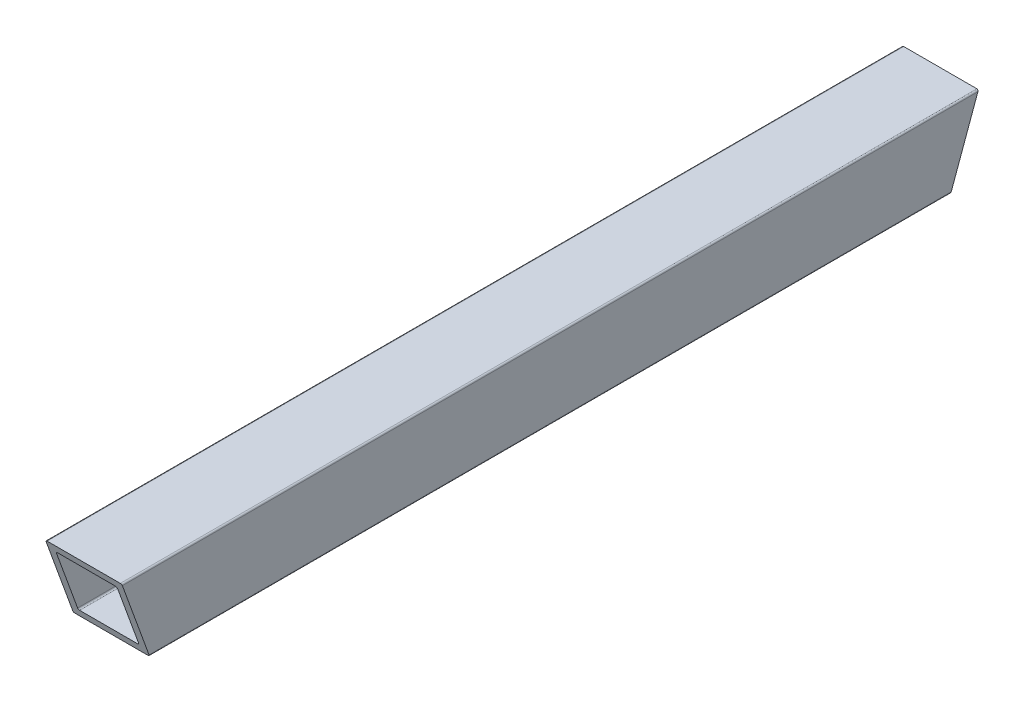
ISO-10303-21;
HEADER;
FILE_DESCRIPTION(('STEP AP214'),'2;1');
FILE_NAME('part.step','',(''),(''),'','','');
FILE_SCHEMA(('AUTOMOTIVE_DESIGN { 1 0 10303 214 1 1 1 1 }'));
ENDSEC;
DATA;
#1=APPLICATION_CONTEXT('core data for automotive mechanical design processes');
#2=APPLICATION_PROTOCOL_DEFINITION('international standard','automotive_design',2000,#1);
#3=PRODUCT_CONTEXT('',#1,'mechanical');
#4=PRODUCT('Part','Part','',(#3));
#5=PRODUCT_RELATED_PRODUCT_CATEGORY('part','',(#4));
#6=PRODUCT_DEFINITION_FORMATION('','',#4);
#7=PRODUCT_DEFINITION_CONTEXT('part definition',#1,'design');
#8=PRODUCT_DEFINITION('design','',#6,#7);
#9=PRODUCT_DEFINITION_SHAPE('','',#8);
#10=(LENGTH_UNIT() NAMED_UNIT(*) SI_UNIT(.MILLI.,.METRE.));
#11=(NAMED_UNIT(*) PLANE_ANGLE_UNIT() SI_UNIT($,.RADIAN.));
#12=(NAMED_UNIT(*) SI_UNIT($,.STERADIAN.) SOLID_ANGLE_UNIT());
#13=UNCERTAINTY_MEASURE_WITH_UNIT(LENGTH_MEASURE(1.E-05),#10,'distance_accuracy_value','');
#14=(GEOMETRIC_REPRESENTATION_CONTEXT(3) GLOBAL_UNCERTAINTY_ASSIGNED_CONTEXT((#13)) GLOBAL_UNIT_ASSIGNED_CONTEXT((#10,
#11,#12)) REPRESENTATION_CONTEXT('',''));
#15=CARTESIAN_POINT('',(0.,0.,0.));
#16=DIRECTION('',(0.,0.,1.));
#17=DIRECTION('',(1.,0.,0.));
#18=AXIS2_PLACEMENT_3D('',#15,#16,#17);
#19=CARTESIAN_POINT('',(-5.,5.,200.));
#20=DIRECTION('',(1.,0.,0.));
#21=DIRECTION('',(0.,1.,0.));
#22=AXIS2_PLACEMENT_3D('',#19,#20,#21);
#23=PLANE('',#22);
#24=DIRECTION('',(0.,0.,-1.));
#25=VECTOR('',#24,1.);
#26=CARTESIAN_POINT('',(-5.,-4.8,200.));
#27=LINE('',#26,#25);
#28=CARTESIAN_POINT('',(-5.,-4.8,3.56690829580883));
#29=VERTEX_POINT('',#28);
#30=CARTESIAN_POINT('',(-5.,-4.8,108.712496389515));
#31=VERTEX_POINT('',#30);
#32=EDGE_CURVE('E275',#29,#31,#27,.F.);
#33=ORIENTED_EDGE('',*,*,#32,.T.);
#34=DIRECTION('',(0.,0.939692620785907,0.342020143325673));
#35=VECTOR('',#34,1.);
#36=CARTESIAN_POINT('',(-5.,-5.,108.639702342662));
#37=LINE('',#36,#35);
#38=CARTESIAN_POINT('',(-5.,4.8,112.206610638471));
#39=VERTEX_POINT('',#38);
#40=EDGE_CURVE('E163',#31,#39,#37,.T.);
#41=ORIENTED_EDGE('',*,*,#40,.T.);
#42=DIRECTION('',(0.,0.,-1.));
#43=VECTOR('',#42,1.);
#44=CARTESIAN_POINT('',(-5.,4.8,200.));
#45=LINE('',#44,#43);
#46=CARTESIAN_POINT('',(-5.,4.8,0.0727940468532356));
#47=VERTEX_POINT('',#46);
#48=EDGE_CURVE('E273',#39,#47,#45,.T.);
#49=ORIENTED_EDGE('',*,*,#48,.T.);
#50=DIRECTION('',(0.,-0.939692620785907,0.342020143325673));
#51=VECTOR('',#50,1.);
#52=CARTESIAN_POINT('',(-5.,-5.,3.63970234266207));
#53=LINE('',#52,#51);
#54=EDGE_CURVE('E187',#47,#29,#53,.T.);
#55=ORIENTED_EDGE('',*,*,#54,.T.);
#56=EDGE_LOOP('',(#33,#41,#49,#55));
#57=FACE_BOUND('',#56,.T.);
#58=ADVANCED_FACE('F34',(#57),#23,.F.);
#59=CARTESIAN_POINT('',(-5.,-5.,200.));
#60=DIRECTION('',(0.,1.,0.));
#61=DIRECTION('',(-1.,0.,0.));
#62=AXIS2_PLACEMENT_3D('',#59,#60,#61);
#63=PLANE('',#62);
#64=DIRECTION('',(0.,0.,-1.));
#65=VECTOR('',#64,1.);
#66=CARTESIAN_POINT('',(4.8,-5.,200.));
#67=LINE('',#66,#65);
#68=CARTESIAN_POINT('',(4.8,-5.,3.63970234266207));
#69=VERTEX_POINT('',#68);
#70=CARTESIAN_POINT('',(4.8,-5.,108.639702342662));
#71=VERTEX_POINT('',#70);
#72=EDGE_CURVE('E269',#69,#71,#67,.F.);
#73=ORIENTED_EDGE('',*,*,#72,.T.);
#74=DIRECTION('',(1.,0.,0.));
#75=VECTOR('',#74,1.);
#76=CARTESIAN_POINT('',(-5.,-5.,108.639702342662));
#77=LINE('',#76,#75);
#78=CARTESIAN_POINT('',(-4.8,-5.,108.639702342662));
#79=VERTEX_POINT('',#78);
#80=EDGE_CURVE('E147',#79,#71,#77,.T.);
#81=ORIENTED_EDGE('',*,*,#80,.F.);
#82=DIRECTION('',(0.,0.,-1.));
#83=VECTOR('',#82,1.);
#84=CARTESIAN_POINT('',(-4.8,-5.,200.));
#85=LINE('',#84,#83);
#86=CARTESIAN_POINT('',(-4.8,-5.,3.63970234266207));
#87=VERTEX_POINT('',#86);
#88=EDGE_CURVE('E271',#79,#87,#85,.T.);
#89=ORIENTED_EDGE('',*,*,#88,.T.);
#90=DIRECTION('',(1.,0.,0.));
#91=VECTOR('',#90,1.);
#92=CARTESIAN_POINT('',(-5.,-5.,3.63970234266207));
#93=LINE('',#92,#91);
#94=EDGE_CURVE('E220',#87,#69,#93,.T.);
#95=ORIENTED_EDGE('',*,*,#94,.T.);
#96=EDGE_LOOP('',(#73,#81,#89,#95));
#97=FACE_BOUND('',#96,.T.);
#98=ADVANCED_FACE('F318',(#97),#63,.F.);
#99=CARTESIAN_POINT('',(5.,5.,200.));
#100=DIRECTION('',(-1.,0.,0.));
#101=DIRECTION('',(0.,-1.,0.));
#102=AXIS2_PLACEMENT_3D('',#99,#100,#101);
#103=PLANE('',#102);
#104=DIRECTION('',(0.,0.,-1.));
#105=VECTOR('',#104,1.);
#106=CARTESIAN_POINT('',(5.,4.8,200.));
#107=LINE('',#106,#105);
#108=CARTESIAN_POINT('',(5.,4.8,0.0727940468532356));
#109=VERTEX_POINT('',#108);
#110=CARTESIAN_POINT('',(5.,4.8,112.206610638471));
#111=VERTEX_POINT('',#110);
#112=EDGE_CURVE('E162',#109,#111,#107,.F.);
#113=ORIENTED_EDGE('',*,*,#112,.T.);
#114=DIRECTION('',(0.,0.939692620785907,0.342020143325673));
#115=VECTOR('',#114,1.);
#116=CARTESIAN_POINT('',(5.,-5.,108.639702342662));
#117=LINE('',#116,#115);
#118=CARTESIAN_POINT('',(5.,-4.8,108.712496389515));
#119=VERTEX_POINT('',#118);
#120=EDGE_CURVE('E56',#119,#111,#117,.T.);
#121=ORIENTED_EDGE('',*,*,#120,.F.);
#122=DIRECTION('',(0.,0.,-1.));
#123=VECTOR('',#122,1.);
#124=CARTESIAN_POINT('',(5.,-4.8,200.));
#125=LINE('',#124,#123);
#126=CARTESIAN_POINT('',(5.,-4.8,3.56690829580883));
#127=VERTEX_POINT('',#126);
#128=EDGE_CURVE('E159',#119,#127,#125,.T.);
#129=ORIENTED_EDGE('',*,*,#128,.T.);
#130=DIRECTION('',(0.,-0.939692620785907,0.342020143325673));
#131=VECTOR('',#130,1.);
#132=CARTESIAN_POINT('',(5.,-5.,3.63970234266207));
#133=LINE('',#132,#131);
#134=EDGE_CURVE('E182',#109,#127,#133,.T.);
#135=ORIENTED_EDGE('',*,*,#134,.F.);
#136=EDGE_LOOP('',(#113,#121,#129,#135));
#137=FACE_BOUND('',#136,.T.);
#138=ADVANCED_FACE('F157',(#137),#103,.F.);
#139=CARTESIAN_POINT('',(-5.,5.,200.));
#140=DIRECTION('',(0.,-1.,0.));
#141=DIRECTION('',(1.,0.,0.));
#142=AXIS2_PLACEMENT_3D('',#139,#140,#141);
#143=PLANE('',#142);
#144=DIRECTION('',(0.,0.,-1.));
#145=VECTOR('',#144,1.);
#146=CARTESIAN_POINT('',(-4.8,5.,200.));
#147=LINE('',#146,#145);
#148=CARTESIAN_POINT('',(-4.8,5.,0.));
#149=VERTEX_POINT('',#148);
#150=CARTESIAN_POINT('',(-4.8,5.,112.279404685324));
#151=VERTEX_POINT('',#150);
#152=EDGE_CURVE('E170',#149,#151,#147,.F.);
#153=ORIENTED_EDGE('',*,*,#152,.T.);
#154=DIRECTION('',(1.,0.,0.));
#155=VECTOR('',#154,1.);
#156=CARTESIAN_POINT('',(-5.,5.,112.279404685324));
#157=LINE('',#156,#155);
#158=CARTESIAN_POINT('',(4.8,5.,112.279404685324));
#159=VERTEX_POINT('',#158);
#160=EDGE_CURVE('E190',#151,#159,#157,.T.);
#161=ORIENTED_EDGE('',*,*,#160,.T.);
#162=DIRECTION('',(0.,0.,-1.));
#163=VECTOR('',#162,1.);
#164=CARTESIAN_POINT('',(4.8,5.,200.));
#165=LINE('',#164,#163);
#166=CARTESIAN_POINT('',(4.8,5.,0.));
#167=VERTEX_POINT('',#166);
#168=EDGE_CURVE('E168',#159,#167,#165,.T.);
#169=ORIENTED_EDGE('',*,*,#168,.T.);
#170=DIRECTION('',(-1.,0.,0.));
#171=VECTOR('',#170,1.);
#172=CARTESIAN_POINT('',(-5.,5.,0.));
#173=LINE('',#172,#171);
#174=EDGE_CURVE('E184',#167,#149,#173,.T.);
#175=ORIENTED_EDGE('',*,*,#174,.T.);
#176=EDGE_LOOP('',(#153,#161,#169,#175));
#177=FACE_BOUND('',#176,.T.);
#178=ADVANCED_FACE('F193',(#177),#143,.F.);
#179=CARTESIAN_POINT('',(-4.,4.,200.));
#180=DIRECTION('',(1.,0.,0.));
#181=DIRECTION('',(0.,1.,0.));
#182=AXIS2_PLACEMENT_3D('',#179,#180,#181);
#183=PLANE('',#182);
#184=DIRECTION('',(0.,0.939692620785907,0.342020143325673));
#185=VECTOR('',#184,1.);
#186=CARTESIAN_POINT('',(-4.,32.3098336697412,122.219371243871));
#187=LINE('',#186,#185);
#188=CARTESIAN_POINT('',(-4.,-3.8,109.076466623782));
#189=VERTEX_POINT('',#188);
#190=CARTESIAN_POINT('',(-4.,3.8,111.842640404205));
#191=VERTEX_POINT('',#190);
#192=EDGE_CURVE('E202',#189,#191,#187,.T.);
#193=ORIENTED_EDGE('',*,*,#192,.F.);
#194=DIRECTION('',(0.,0.,-1.));
#195=VECTOR('',#194,1.);
#196=CARTESIAN_POINT('',(-4.,-3.8,0.));
#197=LINE('',#196,#195);
#198=CARTESIAN_POINT('',(-4.,-3.8,3.20293806154262));
#199=VERTEX_POINT('',#198);
#200=EDGE_CURVE('E264',#189,#199,#197,.T.);
#201=ORIENTED_EDGE('',*,*,#200,.T.);
#202=DIRECTION('',(0.,-0.939692620785907,0.342020143325673));
#203=VECTOR('',#202,1.);
#204=CARTESIAN_POINT('',(-3.99999999999999,-60.1617831902141,23.716949492946));
#205=LINE('',#204,#203);
#206=CARTESIAN_POINT('',(-4.,3.8,0.436764281119419));
#207=VERTEX_POINT('',#206);
#208=EDGE_CURVE('E230',#207,#199,#205,.T.);
#209=ORIENTED_EDGE('',*,*,#208,.F.);
#210=DIRECTION('',(0.,0.,-1.));
#211=VECTOR('',#210,1.);
#212=CARTESIAN_POINT('',(-4.,3.8,200.));
#213=LINE('',#212,#211);
#214=EDGE_CURVE('E266',#207,#191,#213,.F.);
#215=ORIENTED_EDGE('',*,*,#214,.T.);
#216=EDGE_LOOP('',(#193,#201,#209,#215));
#217=FACE_BOUND('',#216,.T.);
#218=ADVANCED_FACE('F307',(#217),#183,.T.);
#219=CARTESIAN_POINT('',(-4.,-4.,200.));
#220=DIRECTION('',(0.,1.,0.));
#221=DIRECTION('',(0.,0.,1.));
#222=AXIS2_PLACEMENT_3D('',#219,#220,#221);
#223=PLANE('',#222);
#224=DIRECTION('',(-1.,0.,0.));
#225=VECTOR('',#224,1.);
#226=CARTESIAN_POINT('',(-4.00000000000001,-4.,109.003672576928));
#227=LINE('',#226,#225);
#228=CARTESIAN_POINT('',(3.8,-4.,109.003672576928));
#229=VERTEX_POINT('',#228);
#230=CARTESIAN_POINT('',(-3.8,-4.,109.003672576928));
#231=VERTEX_POINT('',#230);
#232=EDGE_CURVE('E49',#229,#231,#227,.T.);
#233=ORIENTED_EDGE('',*,*,#232,.F.);
#234=DIRECTION('',(0.,0.,-1.));
#235=VECTOR('',#234,1.);
#236=CARTESIAN_POINT('',(3.8,-4.,0.));
#237=LINE('',#236,#235);
#238=CARTESIAN_POINT('',(3.8,-4.,3.27573210839585));
#239=VERTEX_POINT('',#238);
#240=EDGE_CURVE('E172',#229,#239,#237,.T.);
#241=ORIENTED_EDGE('',*,*,#240,.T.);
#242=DIRECTION('',(1.,0.,0.));
#243=VECTOR('',#242,1.);
#244=CARTESIAN_POINT('',(-3.99999999999999,-4.,3.27573210839585));
#245=LINE('',#244,#243);
#246=CARTESIAN_POINT('',(-3.8,-4.,3.27573210839588));
#247=VERTEX_POINT('',#246);
#248=EDGE_CURVE('E227',#247,#239,#245,.T.);
#249=ORIENTED_EDGE('',*,*,#248,.F.);
#250=DIRECTION('',(0.,0.,-1.));
#251=VECTOR('',#250,1.);
#252=CARTESIAN_POINT('',(-3.8,-4.,200.));
#253=LINE('',#252,#251);
#254=EDGE_CURVE('E278',#247,#231,#253,.F.);
#255=ORIENTED_EDGE('',*,*,#254,.T.);
#256=EDGE_LOOP('',(#233,#241,#249,#255));
#257=FACE_BOUND('',#256,.T.);
#258=ADVANCED_FACE('F283',(#257),#223,.T.);
#259=CARTESIAN_POINT('',(4.,4.,200.));
#260=DIRECTION('',(-1.,0.,0.));
#261=DIRECTION('',(0.,-1.,0.));
#262=AXIS2_PLACEMENT_3D('',#259,#260,#261);
#263=PLANE('',#262);
#264=DIRECTION('',(0.,-0.939692620785907,-0.342020143325673));
#265=VECTOR('',#264,1.);
#266=CARTESIAN_POINT('',(3.99999999999999,32.3098336697412,122.219371243871));
#267=LINE('',#266,#265);
#268=CARTESIAN_POINT('',(4.,3.8,111.842640404205));
#269=VERTEX_POINT('',#268);
#270=CARTESIAN_POINT('',(4.,-3.8,109.076466623782));
#271=VERTEX_POINT('',#270);
#272=EDGE_CURVE('E212',#269,#271,#267,.T.);
#273=ORIENTED_EDGE('',*,*,#272,.F.);
#274=DIRECTION('',(0.,0.,-1.));
#275=VECTOR('',#274,1.);
#276=CARTESIAN_POINT('',(4.,3.8,0.));
#277=LINE('',#276,#275);
#278=CARTESIAN_POINT('',(4.,3.8,0.436764281119419));
#279=VERTEX_POINT('',#278);
#280=EDGE_CURVE('E257',#269,#279,#277,.T.);
#281=ORIENTED_EDGE('',*,*,#280,.T.);
#282=DIRECTION('',(0.,0.939692620785907,-0.342020143325673));
#283=VECTOR('',#282,1.);
#284=CARTESIAN_POINT('',(4.00000000000002,-60.1617831902141,23.716949492946));
#285=LINE('',#284,#283);
#286=CARTESIAN_POINT('',(4.,-3.8,3.20293806154262));
#287=VERTEX_POINT('',#286);
#288=EDGE_CURVE('E242',#287,#279,#285,.T.);
#289=ORIENTED_EDGE('',*,*,#288,.F.);
#290=DIRECTION('',(0.,0.,-1.));
#291=VECTOR('',#290,1.);
#292=CARTESIAN_POINT('',(4.,-3.8,200.));
#293=LINE('',#292,#291);
#294=EDGE_CURVE('E254',#287,#271,#293,.F.);
#295=ORIENTED_EDGE('',*,*,#294,.T.);
#296=EDGE_LOOP('',(#273,#281,#289,#295));
#297=FACE_BOUND('',#296,.T.);
#298=ADVANCED_FACE('F291',(#297),#263,.T.);
#299=CARTESIAN_POINT('',(-4.,4.,200.));
#300=DIRECTION('',(0.,-1.,0.));
#301=DIRECTION('',(0.,0.,-1.));
#302=AXIS2_PLACEMENT_3D('',#299,#300,#301);
#303=PLANE('',#302);
#304=DIRECTION('',(1.,0.,0.));
#305=VECTOR('',#304,1.);
#306=CARTESIAN_POINT('',(-4.00000000000001,4.,111.915434451058));
#307=LINE('',#306,#305);
#308=CARTESIAN_POINT('',(-3.8,4.,111.915434451058));
#309=VERTEX_POINT('',#308);
#310=CARTESIAN_POINT('',(3.8,4.,111.915434451058));
#311=VERTEX_POINT('',#310);
#312=EDGE_CURVE('E210',#309,#311,#307,.T.);
#313=ORIENTED_EDGE('',*,*,#312,.F.);
#314=DIRECTION('',(0.,0.,-1.));
#315=VECTOR('',#314,1.);
#316=CARTESIAN_POINT('',(-3.8,4.,0.));
#317=LINE('',#316,#315);
#318=CARTESIAN_POINT('',(-3.8,4.,0.363970234266198));
#319=VERTEX_POINT('',#318);
#320=EDGE_CURVE('E259',#309,#319,#317,.T.);
#321=ORIENTED_EDGE('',*,*,#320,.T.);
#322=DIRECTION('',(-1.,0.,0.));
#323=VECTOR('',#322,1.);
#324=CARTESIAN_POINT('',(-3.99999999999999,4.,0.363970234266181));
#325=LINE('',#324,#323);
#326=CARTESIAN_POINT('',(3.8,4.,0.363970234266182));
#327=VERTEX_POINT('',#326);
#328=EDGE_CURVE('E239',#327,#319,#325,.T.);
#329=ORIENTED_EDGE('',*,*,#328,.F.);
#330=DIRECTION('',(0.,0.,-1.));
#331=VECTOR('',#330,1.);
#332=CARTESIAN_POINT('',(3.8,4.,200.));
#333=LINE('',#332,#331);
#334=EDGE_CURVE('E261',#327,#311,#333,.F.);
#335=ORIENTED_EDGE('',*,*,#334,.T.);
#336=EDGE_LOOP('',(#313,#321,#329,#335));
#337=FACE_BOUND('',#336,.T.);
#338=ADVANCED_FACE('F299',(#337),#303,.T.);
#339=CARTESIAN_POINT('',(3.8,3.8,200.));
#340=DIRECTION('',(0.,0.,1.));
#341=DIRECTION('',(1.,0.,0.));
#342=AXIS2_PLACEMENT_3D('',#339,#340,#341);
#343=CYLINDRICAL_SURFACE('',#342,0.2);
#344=ORIENTED_EDGE('',*,*,#280,.F.);
#345=CARTESIAN_POINT('',(3.8,3.8,111.842640404205));
#346=DIRECTION('',(0.,0.342020143325673,-0.939692620785907));
#347=DIRECTION('',(0.,0.939692620785907,0.342020143325673));
#348=AXIS2_PLACEMENT_3D('',#345,#346,#347);
#349=ELLIPSE('',#348,0.212835554495183,0.2);
#350=EDGE_CURVE('E214',#269,#311,#349,.F.);
#351=ORIENTED_EDGE('',*,*,#350,.T.);
#352=ORIENTED_EDGE('',*,*,#334,.F.);
#353=CARTESIAN_POINT('',(3.8,3.8,0.436764281119439));
#354=DIRECTION('',(0.,0.342020143325673,0.939692620785907));
#355=DIRECTION('',(0.,-0.939692620785907,0.342020143325673));
#356=AXIS2_PLACEMENT_3D('',#353,#354,#355);
#357=ELLIPSE('',#356,0.212835554495183,0.2);
#358=EDGE_CURVE('E245',#327,#279,#357,.F.);
#359=ORIENTED_EDGE('',*,*,#358,.T.);
#360=EDGE_LOOP('',(#344,#351,#352,#359));
#361=FACE_BOUND('',#360,.T.);
#362=ADVANCED_FACE('F296',(#361),#343,.F.);
#363=CARTESIAN_POINT('',(-3.8,3.8,200.));
#364=DIRECTION('',(0.,0.,1.));
#365=DIRECTION('',(1.,0.,0.));
#366=AXIS2_PLACEMENT_3D('',#363,#364,#365);
#367=CYLINDRICAL_SURFACE('',#366,0.2);
#368=ORIENTED_EDGE('',*,*,#320,.F.);
#369=CARTESIAN_POINT('',(-3.8,3.8,111.842640404205));
#370=DIRECTION('',(0.,0.342020143325673,-0.939692620785907));
#371=DIRECTION('',(0.,0.939692620785907,0.342020143325673));
#372=AXIS2_PLACEMENT_3D('',#369,#370,#371);
#373=ELLIPSE('',#372,0.212835554495183,0.2);
#374=EDGE_CURVE('E207',#309,#191,#373,.F.);
#375=ORIENTED_EDGE('',*,*,#374,.T.);
#376=ORIENTED_EDGE('',*,*,#214,.F.);
#377=CARTESIAN_POINT('',(-3.8,3.8,0.436764281119439));
#378=DIRECTION('',(0.,0.342020143325673,0.939692620785907));
#379=DIRECTION('',(0.,-0.939692620785907,0.342020143325673));
#380=AXIS2_PLACEMENT_3D('',#377,#378,#379);
#381=ELLIPSE('',#380,0.212835554495183,0.2);
#382=EDGE_CURVE('E236',#207,#319,#381,.F.);
#383=ORIENTED_EDGE('',*,*,#382,.T.);
#384=EDGE_LOOP('',(#368,#375,#376,#383));
#385=FACE_BOUND('',#384,.T.);
#386=ADVANCED_FACE('F304',(#385),#367,.F.);
#387=CARTESIAN_POINT('',(-4.8,-4.8,200.));
#388=DIRECTION('',(0.,0.,-1.));
#389=DIRECTION('',(-1.,0.,0.));
#390=AXIS2_PLACEMENT_3D('',#387,#388,#389);
#391=CYLINDRICAL_SURFACE('',#390,0.2);
#392=CARTESIAN_POINT('',(-4.8,-4.8,108.712496389515));
#393=DIRECTION('',(0.,0.342020143325673,-0.939692620785907));
#394=DIRECTION('',(0.,-0.939692620785907,-0.342020143325673));
#395=AXIS2_PLACEMENT_3D('',#392,#393,#394);
#396=ELLIPSE('',#395,0.212835554495183,0.2);
#397=EDGE_CURVE('E152',#31,#79,#396,.F.);
#398=ORIENTED_EDGE('',*,*,#397,.F.);
#399=ORIENTED_EDGE('',*,*,#32,.F.);
#400=CARTESIAN_POINT('',(-4.8,-4.8,3.5669082958088));
#401=DIRECTION('',(0.,0.342020143325673,0.939692620785907));
#402=DIRECTION('',(0.,0.939692620785907,-0.342020143325673));
#403=AXIS2_PLACEMENT_3D('',#400,#401,#402);
#404=ELLIPSE('',#403,0.212835554495183,0.2);
#405=EDGE_CURVE('E251',#87,#29,#404,.F.);
#406=ORIENTED_EDGE('',*,*,#405,.F.);
#407=ORIENTED_EDGE('',*,*,#88,.F.);
#408=EDGE_LOOP('',(#398,#399,#406,#407));
#409=FACE_BOUND('',#408,.T.);
#410=ADVANCED_FACE('F332',(#409),#391,.T.);
#411=CARTESIAN_POINT('',(3.8,-3.8,200.));
#412=DIRECTION('',(0.,0.,1.));
#413=DIRECTION('',(1.,0.,0.));
#414=AXIS2_PLACEMENT_3D('',#411,#412,#413);
#415=CYLINDRICAL_SURFACE('',#414,0.2);
#416=ORIENTED_EDGE('',*,*,#240,.F.);
#417=CARTESIAN_POINT('',(3.8,-3.8,109.076466623782));
#418=DIRECTION('',(0.,0.342020143325673,-0.939692620785907));
#419=DIRECTION('',(0.,0.939692620785907,0.342020143325673));
#420=AXIS2_PLACEMENT_3D('',#417,#418,#419);
#421=ELLIPSE('',#420,0.212835554495183,0.2);
#422=EDGE_CURVE('E204',#229,#271,#421,.F.);
#423=ORIENTED_EDGE('',*,*,#422,.T.);
#424=ORIENTED_EDGE('',*,*,#294,.F.);
#425=CARTESIAN_POINT('',(3.8,-3.8,3.20293806154262));
#426=DIRECTION('',(0.,0.342020143325673,0.939692620785907));
#427=DIRECTION('',(0.,-0.939692620785907,0.342020143325673));
#428=AXIS2_PLACEMENT_3D('',#425,#426,#427);
#429=ELLIPSE('',#428,0.212835554495183,0.2);
#430=EDGE_CURVE('E233',#287,#239,#429,.F.);
#431=ORIENTED_EDGE('',*,*,#430,.T.);
#432=EDGE_LOOP('',(#416,#423,#424,#431));
#433=FACE_BOUND('',#432,.T.);
#434=ADVANCED_FACE('F288',(#433),#415,.F.);
#435=CARTESIAN_POINT('',(4.8,-4.8,200.));
#436=DIRECTION('',(0.,0.,-1.));
#437=DIRECTION('',(-1.,0.,0.));
#438=AXIS2_PLACEMENT_3D('',#435,#436,#437);
#439=CYLINDRICAL_SURFACE('',#438,0.2);
#440=CARTESIAN_POINT('',(4.8,-4.8,108.712496389515));
#441=DIRECTION('',(0.,0.342020143325673,-0.939692620785907));
#442=DIRECTION('',(0.,-0.939692620785907,-0.342020143325673));
#443=AXIS2_PLACEMENT_3D('',#440,#441,#442);
#444=ELLIPSE('',#443,0.212835554495183,0.2);
#445=EDGE_CURVE('E144',#71,#119,#444,.F.);
#446=ORIENTED_EDGE('',*,*,#445,.F.);
#447=ORIENTED_EDGE('',*,*,#72,.F.);
#448=CARTESIAN_POINT('',(4.8,-4.8,3.5669082958088));
#449=DIRECTION('',(0.,0.342020143325673,0.939692620785907));
#450=DIRECTION('',(0.,0.939692620785907,-0.342020143325673));
#451=AXIS2_PLACEMENT_3D('',#448,#449,#450);
#452=ELLIPSE('',#451,0.212835554495183,0.2);
#453=EDGE_CURVE('E167',#127,#69,#452,.F.);
#454=ORIENTED_EDGE('',*,*,#453,.F.);
#455=ORIENTED_EDGE('',*,*,#128,.F.);
#456=EDGE_LOOP('',(#446,#447,#454,#455));
#457=FACE_BOUND('',#456,.T.);
#458=ADVANCED_FACE('F166',(#457),#439,.T.);
#459=CARTESIAN_POINT('',(-4.8,4.8,200.));
#460=DIRECTION('',(0.,0.,-1.));
#461=DIRECTION('',(-1.,0.,0.));
#462=AXIS2_PLACEMENT_3D('',#459,#460,#461);
#463=CYLINDRICAL_SURFACE('',#462,0.2);
#464=CARTESIAN_POINT('',(-4.8,4.8,112.206610638471));
#465=DIRECTION('',(0.,0.342020143325673,-0.939692620785907));
#466=DIRECTION('',(0.,-0.939692620785907,-0.342020143325673));
#467=AXIS2_PLACEMENT_3D('',#464,#465,#466);
#468=ELLIPSE('',#467,0.212835554495183,0.2);
#469=EDGE_CURVE('E153',#151,#39,#468,.F.);
#470=ORIENTED_EDGE('',*,*,#469,.F.);
#471=ORIENTED_EDGE('',*,*,#152,.F.);
#472=CARTESIAN_POINT('',(-4.8,4.8,0.0727940468532307));
#473=DIRECTION('',(0.,0.342020143325673,0.939692620785907));
#474=DIRECTION('',(0.,0.939692620785907,-0.342020143325673));
#475=AXIS2_PLACEMENT_3D('',#472,#473,#474);
#476=ELLIPSE('',#475,0.212835554495183,0.2);
#477=EDGE_CURVE('E248',#47,#149,#476,.F.);
#478=ORIENTED_EDGE('',*,*,#477,.F.);
#479=ORIENTED_EDGE('',*,*,#48,.F.);
#480=EDGE_LOOP('',(#470,#471,#478,#479));
#481=FACE_BOUND('',#480,.T.);
#482=ADVANCED_FACE('F340',(#481),#463,.T.);
#483=CARTESIAN_POINT('',(-3.8,-3.8,200.));
#484=DIRECTION('',(0.,0.,1.));
#485=DIRECTION('',(1.,0.,0.));
#486=AXIS2_PLACEMENT_3D('',#483,#484,#485);
#487=CYLINDRICAL_SURFACE('',#486,0.2);
#488=ORIENTED_EDGE('',*,*,#200,.F.);
#489=CARTESIAN_POINT('',(-3.8,-3.8,109.076466623782));
#490=DIRECTION('',(0.,0.342020143325673,-0.939692620785907));
#491=DIRECTION('',(0.,0.939692620785907,0.342020143325673));
#492=AXIS2_PLACEMENT_3D('',#489,#490,#491);
#493=ELLIPSE('',#492,0.212835554495183,0.2);
#494=EDGE_CURVE('E195',#189,#231,#493,.F.);
#495=ORIENTED_EDGE('',*,*,#494,.T.);
#496=ORIENTED_EDGE('',*,*,#254,.F.);
#497=CARTESIAN_POINT('',(-3.8,-3.8,3.20293806154262));
#498=DIRECTION('',(0.,0.342020143325673,0.939692620785907));
#499=DIRECTION('',(0.,-0.939692620785907,0.342020143325673));
#500=AXIS2_PLACEMENT_3D('',#497,#498,#499);
#501=ELLIPSE('',#500,0.212835554495183,0.2);
#502=EDGE_CURVE('E224',#247,#199,#501,.F.);
#503=ORIENTED_EDGE('',*,*,#502,.T.);
#504=EDGE_LOOP('',(#488,#495,#496,#503));
#505=FACE_BOUND('',#504,.T.);
#506=ADVANCED_FACE('F310',(#505),#487,.F.);
#507=CARTESIAN_POINT('',(4.8,4.8,200.));
#508=DIRECTION('',(0.,0.,-1.));
#509=DIRECTION('',(-1.,0.,0.));
#510=AXIS2_PLACEMENT_3D('',#507,#508,#509);
#511=CYLINDRICAL_SURFACE('',#510,0.2);
#512=CARTESIAN_POINT('',(4.8,4.8,112.206610638471));
#513=DIRECTION('',(0.,0.342020143325673,-0.939692620785907));
#514=DIRECTION('',(0.,-0.939692620785907,-0.342020143325673));
#515=AXIS2_PLACEMENT_3D('',#512,#513,#514);
#516=ELLIPSE('',#515,0.212835554495183,0.2);
#517=EDGE_CURVE('E11',#111,#159,#516,.F.);
#518=ORIENTED_EDGE('',*,*,#517,.F.);
#519=ORIENTED_EDGE('',*,*,#112,.F.);
#520=CARTESIAN_POINT('',(4.8,4.8,0.0727940468532307));
#521=DIRECTION('',(0.,0.342020143325673,0.939692620785907));
#522=DIRECTION('',(0.,0.939692620785907,-0.342020143325673));
#523=AXIS2_PLACEMENT_3D('',#520,#521,#522);
#524=ELLIPSE('',#523,0.212835554495183,0.2);
#525=EDGE_CURVE('E42',#167,#109,#524,.F.);
#526=ORIENTED_EDGE('',*,*,#525,.F.);
#527=ORIENTED_EDGE('',*,*,#168,.F.);
#528=EDGE_LOOP('',(#518,#519,#526,#527));
#529=FACE_BOUND('',#528,.T.);
#530=ADVANCED_FACE('F36',(#529),#511,.T.);
#531=CARTESIAN_POINT('',(-5.,-5.,3.63970234266207));
#532=DIRECTION('',(0.,0.342020143325673,0.939692620785907));
#533=DIRECTION('',(0.,-0.939692620785907,0.342020143325673));
#534=AXIS2_PLACEMENT_3D('',#531,#532,#533);
#535=PLANE('',#534);
#536=ORIENTED_EDGE('',*,*,#405,.T.);
#537=ORIENTED_EDGE('',*,*,#54,.F.);
#538=ORIENTED_EDGE('',*,*,#477,.T.);
#539=ORIENTED_EDGE('',*,*,#174,.F.);
#540=ORIENTED_EDGE('',*,*,#525,.T.);
#541=ORIENTED_EDGE('',*,*,#134,.T.);
#542=ORIENTED_EDGE('',*,*,#453,.T.);
#543=ORIENTED_EDGE('',*,*,#94,.F.);
#544=EDGE_LOOP('',(#536,#537,#538,#539,#540,#541,#542,#543));
#545=FACE_BOUND('',#544,.T.);
#546=ORIENTED_EDGE('',*,*,#328,.T.);
#547=ORIENTED_EDGE('',*,*,#382,.F.);
#548=ORIENTED_EDGE('',*,*,#208,.T.);
#549=ORIENTED_EDGE('',*,*,#502,.F.);
#550=ORIENTED_EDGE('',*,*,#248,.T.);
#551=ORIENTED_EDGE('',*,*,#430,.F.);
#552=ORIENTED_EDGE('',*,*,#288,.T.);
#553=ORIENTED_EDGE('',*,*,#358,.F.);
#554=EDGE_LOOP('',(#546,#547,#548,#549,#550,#551,#552,#553));
#555=FACE_BOUND('',#554,.T.);
#556=ADVANCED_FACE('F180',(#545,#555),#535,.F.);
#557=CARTESIAN_POINT('',(-5.,-5.,108.639702342662));
#558=DIRECTION('',(0.,0.342020143325673,-0.939692620785907));
#559=DIRECTION('',(0.,0.939692620785907,0.342020143325673));
#560=AXIS2_PLACEMENT_3D('',#557,#558,#559);
#561=PLANE('',#560);
#562=ORIENTED_EDGE('',*,*,#397,.T.);
#563=ORIENTED_EDGE('',*,*,#80,.T.);
#564=ORIENTED_EDGE('',*,*,#445,.T.);
#565=ORIENTED_EDGE('',*,*,#120,.T.);
#566=ORIENTED_EDGE('',*,*,#517,.T.);
#567=ORIENTED_EDGE('',*,*,#160,.F.);
#568=ORIENTED_EDGE('',*,*,#469,.T.);
#569=ORIENTED_EDGE('',*,*,#40,.F.);
#570=EDGE_LOOP('',(#562,#563,#564,#565,#566,#567,#568,#569));
#571=FACE_BOUND('',#570,.T.);
#572=ORIENTED_EDGE('',*,*,#272,.T.);
#573=ORIENTED_EDGE('',*,*,#422,.F.);
#574=ORIENTED_EDGE('',*,*,#232,.T.);
#575=ORIENTED_EDGE('',*,*,#494,.F.);
#576=ORIENTED_EDGE('',*,*,#192,.T.);
#577=ORIENTED_EDGE('',*,*,#374,.F.);
#578=ORIENTED_EDGE('',*,*,#312,.T.);
#579=ORIENTED_EDGE('',*,*,#350,.F.);
#580=EDGE_LOOP('',(#572,#573,#574,#575,#576,#577,#578,#579));
#581=FACE_BOUND('',#580,.T.);
#582=ADVANCED_FACE('F145',(#571,#581),#561,.F.);
#583=CLOSED_SHELL('',(#58,#98,#138,#178,#218,#258,#298,#338,#362,#386,#410,#434,#458,#482,#506,
#530,#556,#582));
#584=MANIFOLD_SOLID_BREP('B2',#583);
#585=ADVANCED_BREP_SHAPE_REPRESENTATION('',(#18,#584),#14);
#586=SHAPE_DEFINITION_REPRESENTATION(#9,#585);
ENDSEC;
END-ISO-10303-21;
